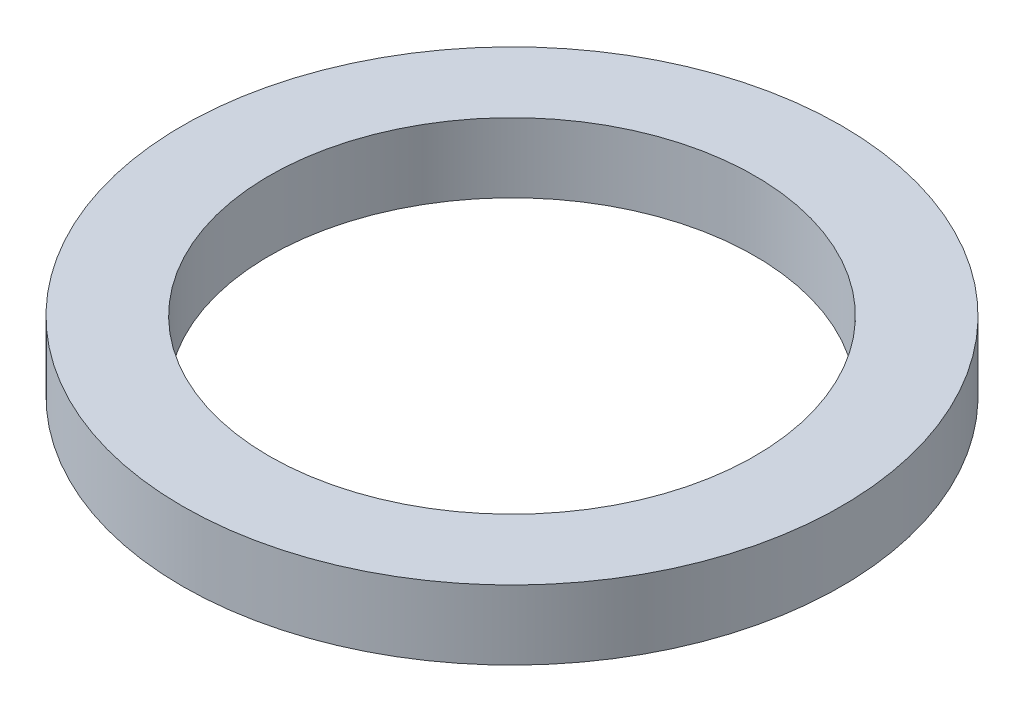
ISO-10303-21;
HEADER;
FILE_DESCRIPTION(('STEP AP214'),'2;1');
FILE_NAME('part.step','',(''),(''),'','','');
FILE_SCHEMA(('AUTOMOTIVE_DESIGN { 1 0 10303 214 1 1 1 1 }'));
ENDSEC;
DATA;
#1=APPLICATION_CONTEXT('core data for automotive mechanical design processes');
#2=APPLICATION_PROTOCOL_DEFINITION('international standard','automotive_design',2000,#1);
#3=PRODUCT_CONTEXT('',#1,'mechanical');
#4=PRODUCT('Part','Part','',(#3));
#5=PRODUCT_RELATED_PRODUCT_CATEGORY('part','',(#4));
#6=PRODUCT_DEFINITION_FORMATION('','',#4);
#7=PRODUCT_DEFINITION_CONTEXT('part definition',#1,'design');
#8=PRODUCT_DEFINITION('design','',#6,#7);
#9=PRODUCT_DEFINITION_SHAPE('','',#8);
#10=(LENGTH_UNIT() NAMED_UNIT(*) SI_UNIT(.MILLI.,.METRE.));
#11=(NAMED_UNIT(*) PLANE_ANGLE_UNIT() SI_UNIT($,.RADIAN.));
#12=(NAMED_UNIT(*) SI_UNIT($,.STERADIAN.) SOLID_ANGLE_UNIT());
#13=UNCERTAINTY_MEASURE_WITH_UNIT(LENGTH_MEASURE(1.E-05),#10,'distance_accuracy_value','');
#14=(GEOMETRIC_REPRESENTATION_CONTEXT(3) GLOBAL_UNCERTAINTY_ASSIGNED_CONTEXT((#13)) GLOBAL_UNIT_ASSIGNED_CONTEXT((#10,
#11,#12)) REPRESENTATION_CONTEXT('',''));
#15=CARTESIAN_POINT('',(0.,0.,0.));
#16=DIRECTION('',(0.,0.,1.));
#17=DIRECTION('',(1.,0.,0.));
#18=AXIS2_PLACEMENT_3D('',#15,#16,#17);
#19=CARTESIAN_POINT('',(0.,10.,0.));
#20=DIRECTION('',(0.,1.,0.));
#21=DIRECTION('',(0.,0.,1.));
#22=AXIS2_PLACEMENT_3D('',#19,#20,#21);
#23=PLANE('',#22);
#24=CARTESIAN_POINT('',(0.,10.,0.));
#25=DIRECTION('',(0.,1.,0.));
#26=DIRECTION('',(0.,0.,1.));
#27=AXIS2_PLACEMENT_3D('',#24,#25,#26);
#28=CIRCLE('',#27,47.5);
#29=CARTESIAN_POINT('',(0.,10.,47.5));
#30=VERTEX_POINT('',#29);
#31=EDGE_CURVE('E10',#30,#30,#28,.T.);
#32=ORIENTED_EDGE('',*,*,#31,.T.);
#33=EDGE_LOOP('',(#32));
#34=FACE_BOUND('',#33,.T.);
#35=CARTESIAN_POINT('',(0.,10.,0.));
#36=DIRECTION('',(0.,1.,0.));
#37=DIRECTION('',(0.,0.,1.));
#38=AXIS2_PLACEMENT_3D('',#35,#36,#37);
#39=CIRCLE('',#38,35.);
#40=CARTESIAN_POINT('',(0.,10.,35.));
#41=VERTEX_POINT('',#40);
#42=EDGE_CURVE('E45',#41,#41,#39,.T.);
#43=ORIENTED_EDGE('',*,*,#42,.F.);
#44=EDGE_LOOP('',(#43));
#45=FACE_BOUND('',#44,.T.);
#46=ADVANCED_FACE('F34',(#34,#45),#23,.T.);
#47=CARTESIAN_POINT('',(0.,0.,0.));
#48=DIRECTION('',(0.,1.,0.));
#49=DIRECTION('',(0.,0.,1.));
#50=AXIS2_PLACEMENT_3D('',#47,#48,#49);
#51=PLANE('',#50);
#52=CARTESIAN_POINT('',(0.,0.,0.));
#53=DIRECTION('',(0.,1.,0.));
#54=DIRECTION('',(0.,0.,1.));
#55=AXIS2_PLACEMENT_3D('',#52,#53,#54);
#56=CIRCLE('',#55,47.5);
#57=CARTESIAN_POINT('',(0.,0.,47.5));
#58=VERTEX_POINT('',#57);
#59=EDGE_CURVE('E38',#58,#58,#56,.T.);
#60=ORIENTED_EDGE('',*,*,#59,.F.);
#61=EDGE_LOOP('',(#60));
#62=FACE_BOUND('',#61,.T.);
#63=CARTESIAN_POINT('',(0.,0.,0.));
#64=DIRECTION('',(0.,1.,0.));
#65=DIRECTION('',(0.,0.,1.));
#66=AXIS2_PLACEMENT_3D('',#63,#64,#65);
#67=CIRCLE('',#66,35.);
#68=CARTESIAN_POINT('',(0.,0.,35.));
#69=VERTEX_POINT('',#68);
#70=EDGE_CURVE('E47',#69,#69,#67,.T.);
#71=ORIENTED_EDGE('',*,*,#70,.T.);
#72=EDGE_LOOP('',(#71));
#73=FACE_BOUND('',#72,.T.);
#74=ADVANCED_FACE('F57',(#62,#73),#51,.F.);
#75=CARTESIAN_POINT('',(0.,10.,0.));
#76=DIRECTION('',(0.,-1.,0.));
#77=DIRECTION('',(0.,0.,-1.));
#78=AXIS2_PLACEMENT_3D('',#75,#76,#77);
#79=CYLINDRICAL_SURFACE('',#78,47.5);
#80=ORIENTED_EDGE('',*,*,#31,.F.);
#81=EDGE_LOOP('',(#80));
#82=FACE_BOUND('',#81,.T.);
#83=ORIENTED_EDGE('',*,*,#59,.T.);
#84=EDGE_LOOP('',(#83));
#85=FACE_BOUND('',#84,.T.);
#86=ADVANCED_FACE('F36',(#82,#85),#79,.T.);
#87=CARTESIAN_POINT('',(0.,10.,0.));
#88=DIRECTION('',(0.,-1.,0.));
#89=DIRECTION('',(0.,0.,-1.));
#90=AXIS2_PLACEMENT_3D('',#87,#88,#89);
#91=CYLINDRICAL_SURFACE('',#90,35.);
#92=ORIENTED_EDGE('',*,*,#42,.T.);
#93=EDGE_LOOP('',(#92));
#94=FACE_BOUND('',#93,.T.);
#95=ORIENTED_EDGE('',*,*,#70,.F.);
#96=EDGE_LOOP('',(#95));
#97=FACE_BOUND('',#96,.T.);
#98=ADVANCED_FACE('F53',(#94,#97),#91,.F.);
#99=CLOSED_SHELL('',(#46,#74,#86,#98));
#100=MANIFOLD_SOLID_BREP('B2',#99);
#101=ADVANCED_BREP_SHAPE_REPRESENTATION('',(#18,#100),#14);
#102=SHAPE_DEFINITION_REPRESENTATION(#9,#101);
ENDSEC;
END-ISO-10303-21;
